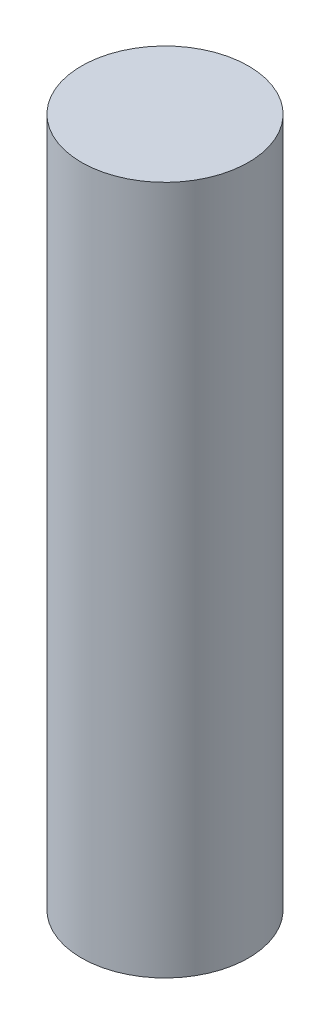
ISO-10303-21;
HEADER;
FILE_DESCRIPTION(('STEP AP214'),'2;1');
FILE_NAME('part.step','',(''),(''),'','','');
FILE_SCHEMA(('AUTOMOTIVE_DESIGN { 1 0 10303 214 1 1 1 1 }'));
ENDSEC;
DATA;
#1=APPLICATION_CONTEXT('core data for automotive mechanical design processes');
#2=APPLICATION_PROTOCOL_DEFINITION('international standard','automotive_design',2000,#1);
#3=PRODUCT_CONTEXT('',#1,'mechanical');
#4=PRODUCT('Part','Part','',(#3));
#5=PRODUCT_RELATED_PRODUCT_CATEGORY('part','',(#4));
#6=PRODUCT_DEFINITION_FORMATION('','',#4);
#7=PRODUCT_DEFINITION_CONTEXT('part definition',#1,'design');
#8=PRODUCT_DEFINITION('design','',#6,#7);
#9=PRODUCT_DEFINITION_SHAPE('','',#8);
#10=(LENGTH_UNIT() NAMED_UNIT(*) SI_UNIT(.MILLI.,.METRE.));
#11=(NAMED_UNIT(*) PLANE_ANGLE_UNIT() SI_UNIT($,.RADIAN.));
#12=(NAMED_UNIT(*) SI_UNIT($,.STERADIAN.) SOLID_ANGLE_UNIT());
#13=UNCERTAINTY_MEASURE_WITH_UNIT(LENGTH_MEASURE(1.E-05),#10,'distance_accuracy_value','');
#14=(GEOMETRIC_REPRESENTATION_CONTEXT(3) GLOBAL_UNCERTAINTY_ASSIGNED_CONTEXT((#13)) GLOBAL_UNIT_ASSIGNED_CONTEXT((#10,
#11,#12)) REPRESENTATION_CONTEXT('',''));
#15=CARTESIAN_POINT('',(0.,0.,0.));
#16=DIRECTION('',(0.,0.,1.));
#17=DIRECTION('',(1.,0.,0.));
#18=AXIS2_PLACEMENT_3D('',#15,#16,#17);
#19=CARTESIAN_POINT('',(0.,33.,0.));
#20=DIRECTION('',(0.,-1.,0.));
#21=DIRECTION('',(0.,0.,-1.));
#22=AXIS2_PLACEMENT_3D('',#19,#20,#21);
#23=CYLINDRICAL_SURFACE('',#22,4.);
#24=CARTESIAN_POINT('',(0.,33.,0.));
#25=DIRECTION('',(0.,1.,0.));
#26=DIRECTION('',(0.,0.,1.));
#27=AXIS2_PLACEMENT_3D('',#24,#25,#26);
#28=CIRCLE('',#27,4.);
#29=CARTESIAN_POINT('',(0.,33.,4.));
#30=VERTEX_POINT('',#29);
#31=EDGE_CURVE('E10',#30,#30,#28,.T.);
#32=ORIENTED_EDGE('',*,*,#31,.F.);
#33=EDGE_LOOP('',(#32));
#34=FACE_BOUND('',#33,.T.);
#35=CARTESIAN_POINT('',(0.,0.,0.));
#36=DIRECTION('',(0.,1.,0.));
#37=DIRECTION('',(0.,0.,1.));
#38=AXIS2_PLACEMENT_3D('',#35,#36,#37);
#39=CIRCLE('',#38,4.);
#40=CARTESIAN_POINT('',(0.,0.,4.));
#41=VERTEX_POINT('',#40);
#42=EDGE_CURVE('E34',#41,#41,#39,.T.);
#43=ORIENTED_EDGE('',*,*,#42,.T.);
#44=EDGE_LOOP('',(#43));
#45=FACE_BOUND('',#44,.T.);
#46=ADVANCED_FACE('F31',(#34,#45),#23,.T.);
#47=CARTESIAN_POINT('',(0.,33.,0.));
#48=DIRECTION('',(0.,1.,0.));
#49=DIRECTION('',(0.,0.,1.));
#50=AXIS2_PLACEMENT_3D('',#47,#48,#49);
#51=PLANE('',#50);
#52=ORIENTED_EDGE('',*,*,#31,.T.);
#53=EDGE_LOOP('',(#52));
#54=FACE_BOUND('',#53,.T.);
#55=ADVANCED_FACE('F46',(#54),#51,.T.);
#56=CARTESIAN_POINT('',(0.,0.,0.));
#57=DIRECTION('',(0.,1.,0.));
#58=DIRECTION('',(0.,0.,1.));
#59=AXIS2_PLACEMENT_3D('',#56,#57,#58);
#60=PLANE('',#59);
#61=ORIENTED_EDGE('',*,*,#42,.F.);
#62=EDGE_LOOP('',(#61));
#63=FACE_BOUND('',#62,.T.);
#64=ADVANCED_FACE('F44',(#63),#60,.F.);
#65=CLOSED_SHELL('',(#46,#55,#64));
#66=MANIFOLD_SOLID_BREP('B2',#65);
#67=ADVANCED_BREP_SHAPE_REPRESENTATION('',(#18,#66),#14);
#68=SHAPE_DEFINITION_REPRESENTATION(#9,#67);
ENDSEC;
END-ISO-10303-21;
